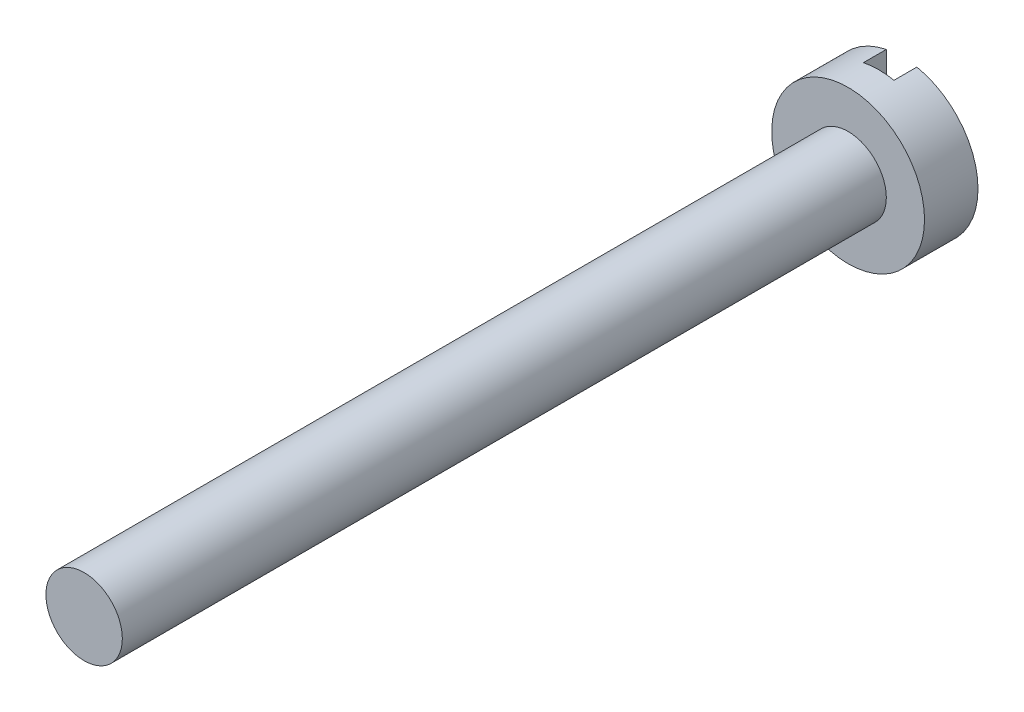
ISO-10303-21;
HEADER;
FILE_DESCRIPTION(('STEP AP214'),'2;1');
FILE_NAME('part.step','',(''),(''),'','','');
FILE_SCHEMA(('AUTOMOTIVE_DESIGN { 1 0 10303 214 1 1 1 1 }'));
ENDSEC;
DATA;
#1=APPLICATION_CONTEXT('core data for automotive mechanical design processes');
#2=APPLICATION_PROTOCOL_DEFINITION('international standard','automotive_design',2000,#1);
#3=PRODUCT_CONTEXT('',#1,'mechanical');
#4=PRODUCT('Part','Part','',(#3));
#5=PRODUCT_RELATED_PRODUCT_CATEGORY('part','',(#4));
#6=PRODUCT_DEFINITION_FORMATION('','',#4);
#7=PRODUCT_DEFINITION_CONTEXT('part definition',#1,'design');
#8=PRODUCT_DEFINITION('design','',#6,#7);
#9=PRODUCT_DEFINITION_SHAPE('','',#8);
#10=(LENGTH_UNIT() NAMED_UNIT(*) SI_UNIT(.MILLI.,.METRE.));
#11=(NAMED_UNIT(*) PLANE_ANGLE_UNIT() SI_UNIT($,.RADIAN.));
#12=(NAMED_UNIT(*) SI_UNIT($,.STERADIAN.) SOLID_ANGLE_UNIT());
#13=UNCERTAINTY_MEASURE_WITH_UNIT(LENGTH_MEASURE(1.E-05),#10,'distance_accuracy_value','');
#14=(GEOMETRIC_REPRESENTATION_CONTEXT(3) GLOBAL_UNCERTAINTY_ASSIGNED_CONTEXT((#13)) GLOBAL_UNIT_ASSIGNED_CONTEXT((#10,
#11,#12)) REPRESENTATION_CONTEXT('',''));
#15=CARTESIAN_POINT('',(0.,0.,0.));
#16=DIRECTION('',(0.,0.,1.));
#17=DIRECTION('',(1.,0.,0.));
#18=AXIS2_PLACEMENT_3D('',#15,#16,#17);
#19=CARTESIAN_POINT('',(0.,0.,0.));
#20=DIRECTION('',(0.,0.,1.));
#21=DIRECTION('',(1.,0.,0.));
#22=AXIS2_PLACEMENT_3D('',#19,#20,#21);
#23=PLANE('',#22);
#24=CARTESIAN_POINT('',(0.,0.,0.));
#25=DIRECTION('',(0.,0.,1.));
#26=DIRECTION('',(1.,0.,0.));
#27=AXIS2_PLACEMENT_3D('',#24,#25,#26);
#28=CIRCLE('',#27,1.);
#29=CARTESIAN_POINT('',(-0.2,0.979795897113271,0.));
#30=VERTEX_POINT('',#29);
#31=CARTESIAN_POINT('',(-0.2,-0.979795897113271,0.));
#32=VERTEX_POINT('',#31);
#33=EDGE_CURVE('E87',#30,#32,#28,.T.);
#34=ORIENTED_EDGE('',*,*,#33,.F.);
#35=DIRECTION('',(0.,-1.,0.));
#36=VECTOR('',#35,1.);
#37=CARTESIAN_POINT('',(-0.2,0.,0.));
#38=LINE('',#37,#36);
#39=EDGE_CURVE('E78',#30,#32,#38,.T.);
#40=ORIENTED_EDGE('',*,*,#39,.T.);
#41=EDGE_LOOP('',(#34,#40));
#42=FACE_BOUND('',#41,.T.);
#43=ADVANCED_FACE('F32',(#42),#23,.F.);
#44=CARTESIAN_POINT('',(0.,0.,0.699999999999999));
#45=DIRECTION('',(0.,0.,1.));
#46=DIRECTION('',(1.,0.,0.));
#47=AXIS2_PLACEMENT_3D('',#44,#45,#46);
#48=PLANE('',#47);
#49=CARTESIAN_POINT('',(0.,0.,0.699999999999999));
#50=DIRECTION('',(0.,0.,1.));
#51=DIRECTION('',(1.,0.,0.));
#52=AXIS2_PLACEMENT_3D('',#49,#50,#51);
#53=CIRCLE('',#52,1.);
#54=CARTESIAN_POINT('',(1.00000000000001,0.,0.699999999999999));
#55=VERTEX_POINT('',#54);
#56=EDGE_CURVE('E79',#55,#55,#53,.T.);
#57=ORIENTED_EDGE('',*,*,#56,.T.);
#58=EDGE_LOOP('',(#57));
#59=FACE_BOUND('',#58,.T.);
#60=CARTESIAN_POINT('',(0.,0.,0.699999999999999));
#61=DIRECTION('',(0.,0.,1.));
#62=DIRECTION('',(1.,0.,0.));
#63=AXIS2_PLACEMENT_3D('',#60,#61,#62);
#64=CIRCLE('',#63,0.5);
#65=CARTESIAN_POINT('',(0.500000000000014,0.,0.699999999999999));
#66=VERTEX_POINT('',#65);
#67=EDGE_CURVE('E92',#66,#66,#64,.T.);
#68=ORIENTED_EDGE('',*,*,#67,.F.);
#69=EDGE_LOOP('',(#68));
#70=FACE_BOUND('',#69,.T.);
#71=ADVANCED_FACE('F117',(#59,#70),#48,.T.);
#72=CARTESIAN_POINT('',(0.,0.,0.699999999999999));
#73=DIRECTION('',(0.,0.,-1.));
#74=DIRECTION('',(-1.,0.,0.));
#75=AXIS2_PLACEMENT_3D('',#72,#73,#74);
#76=CYLINDRICAL_SURFACE('',#75,1.);
#77=CARTESIAN_POINT('',(0.,0.,0.3));
#78=DIRECTION('',(0.,0.,-1.));
#79=DIRECTION('',(-1.,0.,0.));
#80=AXIS2_PLACEMENT_3D('',#77,#78,#79);
#81=CIRCLE('',#80,1.);
#82=CARTESIAN_POINT('',(-0.2,0.979795897113271,0.3));
#83=VERTEX_POINT('',#82);
#84=CARTESIAN_POINT('',(0.2,0.979795897113271,0.3));
#85=VERTEX_POINT('',#84);
#86=EDGE_CURVE('E11',#83,#85,#81,.T.);
#87=ORIENTED_EDGE('',*,*,#86,.F.);
#88=DIRECTION('',(0.,0.,-1.));
#89=VECTOR('',#88,1.);
#90=CARTESIAN_POINT('',(-0.199999999999986,0.979795897113271,0.700000000000001));
#91=LINE('',#90,#89);
#92=EDGE_CURVE('E107',#83,#30,#91,.T.);
#93=ORIENTED_EDGE('',*,*,#92,.T.);
#94=ORIENTED_EDGE('',*,*,#33,.T.);
#95=DIRECTION('',(0.,0.,-1.));
#96=VECTOR('',#95,1.);
#97=CARTESIAN_POINT('',(-0.199999999999986,-0.979795897113271,0.700000000000001));
#98=LINE('',#97,#96);
#99=CARTESIAN_POINT('',(-0.2,-0.979795897113271,0.3));
#100=VERTEX_POINT('',#99);
#101=EDGE_CURVE('E84',#32,#100,#98,.F.);
#102=ORIENTED_EDGE('',*,*,#101,.T.);
#103=CARTESIAN_POINT('',(0.2,-0.979795897113271,0.3));
#104=VERTEX_POINT('',#103);
#105=EDGE_CURVE('E36',#104,#100,#81,.T.);
#106=ORIENTED_EDGE('',*,*,#105,.F.);
#107=DIRECTION('',(0.,0.,-1.));
#108=VECTOR('',#107,1.);
#109=CARTESIAN_POINT('',(0.200000000000014,-0.979795897113271,0.699999999999999));
#110=LINE('',#109,#108);
#111=CARTESIAN_POINT('',(0.2,-0.979795897113271,0.));
#112=VERTEX_POINT('',#111);
#113=EDGE_CURVE('E73',#104,#112,#110,.T.);
#114=ORIENTED_EDGE('',*,*,#113,.T.);
#115=CARTESIAN_POINT('',(0.2,0.979795897113271,0.));
#116=VERTEX_POINT('',#115);
#117=EDGE_CURVE('E82',#112,#116,#28,.T.);
#118=ORIENTED_EDGE('',*,*,#117,.T.);
#119=DIRECTION('',(0.,0.,-1.));
#120=VECTOR('',#119,1.);
#121=CARTESIAN_POINT('',(0.200000000000014,0.979795897113271,0.699999999999999));
#122=LINE('',#121,#120);
#123=EDGE_CURVE('E47',#116,#85,#122,.F.);
#124=ORIENTED_EDGE('',*,*,#123,.T.);
#125=EDGE_LOOP('',(#87,#93,#94,#102,#106,#114,#118,#124));
#126=FACE_BOUND('',#125,.T.);
#127=ORIENTED_EDGE('',*,*,#56,.F.);
#128=EDGE_LOOP('',(#127));
#129=FACE_BOUND('',#128,.T.);
#130=ADVANCED_FACE('F34',(#126,#129),#76,.T.);
#131=ORIENTED_EDGE('',*,*,#117,.F.);
#132=DIRECTION('',(0.,1.,0.));
#133=VECTOR('',#132,1.);
#134=CARTESIAN_POINT('',(0.2,0.,0.));
#135=LINE('',#134,#133);
#136=EDGE_CURVE('E70',#112,#116,#135,.T.);
#137=ORIENTED_EDGE('',*,*,#136,.T.);
#138=EDGE_LOOP('',(#131,#137));
#139=FACE_BOUND('',#138,.T.);
#140=ADVANCED_FACE('F86',(#139),#23,.F.);
#141=CARTESIAN_POINT('',(0.,0.,10.7));
#142=DIRECTION('',(0.,0.,-1.));
#143=DIRECTION('',(-1.,0.,0.));
#144=AXIS2_PLACEMENT_3D('',#141,#142,#143);
#145=CYLINDRICAL_SURFACE('',#144,0.5);
#146=CARTESIAN_POINT('',(0.,0.,10.7));
#147=DIRECTION('',(0.,0.,1.));
#148=DIRECTION('',(1.,0.,0.));
#149=AXIS2_PLACEMENT_3D('',#146,#147,#148);
#150=CIRCLE('',#149,0.5);
#151=CARTESIAN_POINT('',(0.5,0.,10.7));
#152=VERTEX_POINT('',#151);
#153=EDGE_CURVE('E88',#152,#152,#150,.T.);
#154=ORIENTED_EDGE('',*,*,#153,.F.);
#155=EDGE_LOOP('',(#154));
#156=FACE_BOUND('',#155,.T.);
#157=ORIENTED_EDGE('',*,*,#67,.T.);
#158=EDGE_LOOP('',(#157));
#159=FACE_BOUND('',#158,.T.);
#160=ADVANCED_FACE('F115',(#156,#159),#145,.T.);
#161=CARTESIAN_POINT('',(0.,0.,10.7));
#162=DIRECTION('',(0.,0.,1.));
#163=DIRECTION('',(1.,0.,0.));
#164=AXIS2_PLACEMENT_3D('',#161,#162,#163);
#165=PLANE('',#164);
#166=ORIENTED_EDGE('',*,*,#153,.T.);
#167=EDGE_LOOP('',(#166));
#168=FACE_BOUND('',#167,.T.);
#169=ADVANCED_FACE('F132',(#168),#165,.T.);
#170=CARTESIAN_POINT('',(-0.2,-1.,0.3));
#171=DIRECTION('',(0.,0.,-1.));
#172=DIRECTION('',(-1.,0.,0.));
#173=AXIS2_PLACEMENT_3D('',#170,#171,#172);
#174=PLANE('',#173);
#175=DIRECTION('',(0.,1.,0.));
#176=VECTOR('',#175,1.);
#177=CARTESIAN_POINT('',(-0.2,1.,0.3));
#178=LINE('',#177,#176);
#179=EDGE_CURVE('E103',#100,#83,#178,.T.);
#180=ORIENTED_EDGE('',*,*,#179,.T.);
#181=ORIENTED_EDGE('',*,*,#86,.T.);
#182=DIRECTION('',(0.,-1.,0.));
#183=VECTOR('',#182,1.);
#184=CARTESIAN_POINT('',(0.2,1.,0.3));
#185=LINE('',#184,#183);
#186=EDGE_CURVE('E104',#85,#104,#185,.T.);
#187=ORIENTED_EDGE('',*,*,#186,.T.);
#188=ORIENTED_EDGE('',*,*,#105,.T.);
#189=EDGE_LOOP('',(#180,#181,#187,#188));
#190=FACE_BOUND('',#189,.T.);
#191=ADVANCED_FACE('F102',(#190),#174,.T.);
#192=CARTESIAN_POINT('',(-0.2,1.,0.3));
#193=DIRECTION('',(-1.,0.,0.));
#194=DIRECTION('',(0.,-1.,0.));
#195=AXIS2_PLACEMENT_3D('',#192,#193,#194);
#196=PLANE('',#195);
#197=ORIENTED_EDGE('',*,*,#179,.F.);
#198=ORIENTED_EDGE('',*,*,#101,.F.);
#199=ORIENTED_EDGE('',*,*,#39,.F.);
#200=ORIENTED_EDGE('',*,*,#92,.F.);
#201=EDGE_LOOP('',(#197,#198,#199,#200));
#202=FACE_BOUND('',#201,.T.);
#203=ADVANCED_FACE('F106',(#202),#196,.F.);
#204=CARTESIAN_POINT('',(0.2,1.,0.3));
#205=DIRECTION('',(1.,0.,0.));
#206=DIRECTION('',(0.,1.,0.));
#207=AXIS2_PLACEMENT_3D('',#204,#205,#206);
#208=PLANE('',#207);
#209=ORIENTED_EDGE('',*,*,#186,.F.);
#210=ORIENTED_EDGE('',*,*,#123,.F.);
#211=ORIENTED_EDGE('',*,*,#136,.F.);
#212=ORIENTED_EDGE('',*,*,#113,.F.);
#213=EDGE_LOOP('',(#209,#210,#211,#212));
#214=FACE_BOUND('',#213,.T.);
#215=ADVANCED_FACE('F72',(#214),#208,.F.);
#216=CLOSED_SHELL('',(#43,#71,#130,#140,#160,#169,#191,#203,#215));
#217=MANIFOLD_SOLID_BREP('B2',#216);
#218=ADVANCED_BREP_SHAPE_REPRESENTATION('',(#18,#217),#14);
#219=SHAPE_DEFINITION_REPRESENTATION(#9,#218);
ENDSEC;
END-ISO-10303-21;
